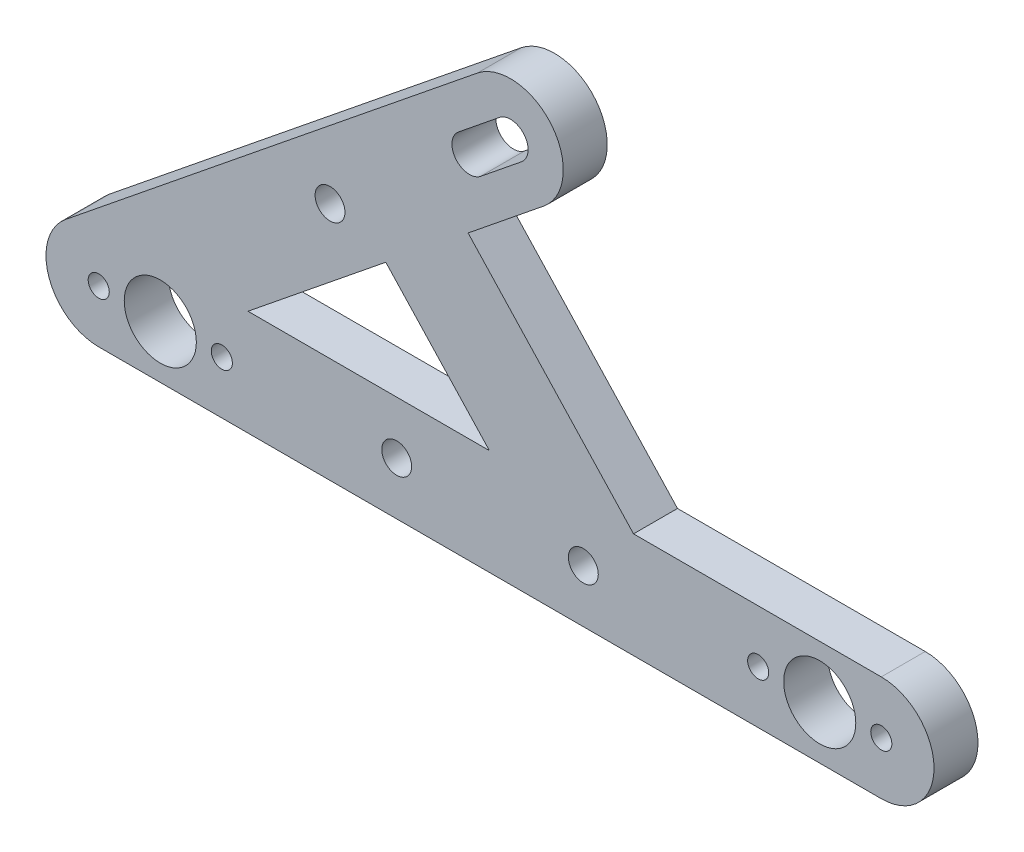
ISO-10303-21;
HEADER;
FILE_DESCRIPTION(('STEP AP214'),'2;1');
FILE_NAME('part.step','',(''),(''),'','','');
FILE_SCHEMA(('AUTOMOTIVE_DESIGN { 1 0 10303 214 1 1 1 1 }'));
ENDSEC;
DATA;
#1=APPLICATION_CONTEXT('core data for automotive mechanical design processes');
#2=APPLICATION_PROTOCOL_DEFINITION('international standard','automotive_design',2000,#1);
#3=PRODUCT_CONTEXT('',#1,'mechanical');
#4=PRODUCT('Part','Part','',(#3));
#5=PRODUCT_RELATED_PRODUCT_CATEGORY('part','',(#4));
#6=PRODUCT_DEFINITION_FORMATION('','',#4);
#7=PRODUCT_DEFINITION_CONTEXT('part definition',#1,'design');
#8=PRODUCT_DEFINITION('design','',#6,#7);
#9=PRODUCT_DEFINITION_SHAPE('','',#8);
#10=(LENGTH_UNIT() NAMED_UNIT(*) SI_UNIT(.MILLI.,.METRE.));
#11=(NAMED_UNIT(*) PLANE_ANGLE_UNIT() SI_UNIT($,.RADIAN.));
#12=(NAMED_UNIT(*) SI_UNIT($,.STERADIAN.) SOLID_ANGLE_UNIT());
#13=UNCERTAINTY_MEASURE_WITH_UNIT(LENGTH_MEASURE(1.E-05),#10,'distance_accuracy_value','');
#14=(GEOMETRIC_REPRESENTATION_CONTEXT(3) GLOBAL_UNCERTAINTY_ASSIGNED_CONTEXT((#13)) GLOBAL_UNIT_ASSIGNED_CONTEXT((#10,
#11,#12)) REPRESENTATION_CONTEXT('',''));
#15=CARTESIAN_POINT('',(0.,0.,0.));
#16=DIRECTION('',(0.,0.,1.));
#17=DIRECTION('',(1.,0.,0.));
#18=AXIS2_PLACEMENT_3D('',#15,#16,#17);
#19=CARTESIAN_POINT('',(-4.90702682254123,-88.9413767681293,0.));
#20=DIRECTION('',(0.,0.,1.));
#21=DIRECTION('',(1.,0.,0.));
#22=AXIS2_PLACEMENT_3D('',#19,#20,#21);
#23=PLANE('',#22);
#24=CARTESIAN_POINT('',(-18.192282617443,21.2543218490518,0.));
#25=DIRECTION('',(0.,0.,1.));
#26=DIRECTION('',(1.,0.,0.));
#27=AXIS2_PLACEMENT_3D('',#24,#25,#26);
#28=CIRCLE('',#27,1.7);
#29=CARTESIAN_POINT('',(-16.492282617443,21.2543218490518,0.));
#30=VERTEX_POINT('',#29);
#31=EDGE_CURVE('E372',#30,#30,#28,.T.);
#32=ORIENTED_EDGE('',*,*,#31,.T.);
#33=EDGE_LOOP('',(#32));
#34=FACE_BOUND('',#33,.T.);
#35=CARTESIAN_POINT('',(10.6132486540519,5.77662917500277E-13,0.));
#36=DIRECTION('',(0.,0.,1.));
#37=DIRECTION('',(1.,0.,0.));
#38=AXIS2_PLACEMENT_3D('',#35,#36,#37);
#39=CIRCLE('',#38,1.7);
#40=CARTESIAN_POINT('',(12.3132486540519,5.77662917500277E-13,0.));
#41=VERTEX_POINT('',#40);
#42=EDGE_CURVE('E382',#41,#41,#39,.T.);
#43=ORIENTED_EDGE('',*,*,#42,.T.);
#44=EDGE_LOOP('',(#43));
#45=FACE_BOUND('',#44,.T.);
#46=CARTESIAN_POINT('',(-10.6132486540519,3.71230823859037E-13,0.));
#47=DIRECTION('',(0.,0.,1.));
#48=DIRECTION('',(1.,0.,0.));
#49=AXIS2_PLACEMENT_3D('',#46,#47,#48);
#50=CIRCLE('',#49,1.7);
#51=CARTESIAN_POINT('',(-8.91324865405189,3.71230823859037E-13,0.));
#52=VERTEX_POINT('',#51);
#53=EDGE_CURVE('E388',#52,#52,#50,.T.);
#54=ORIENTED_EDGE('',*,*,#53,.T.);
#55=EDGE_LOOP('',(#54));
#56=FACE_BOUND('',#55,.T.);
#57=CARTESIAN_POINT('',(37.5,0.,0.));
#58=DIRECTION('',(0.,0.,1.));
#59=DIRECTION('',(1.,0.,0.));
#60=AXIS2_PLACEMENT_3D('',#57,#58,#59);
#61=CIRCLE('',#60,4.1);
#62=CARTESIAN_POINT('',(41.6,0.,0.));
#63=VERTEX_POINT('',#62);
#64=EDGE_CURVE('E393',#63,#63,#61,.T.);
#65=ORIENTED_EDGE('',*,*,#64,.T.);
#66=EDGE_LOOP('',(#65));
#67=FACE_BOUND('',#66,.T.);
#68=CARTESIAN_POINT('',(44.5,0.,0.));
#69=DIRECTION('',(0.,0.,-1.));
#70=DIRECTION('',(-1.,0.,0.));
#71=AXIS2_PLACEMENT_3D('',#68,#69,#70);
#72=CIRCLE('',#71,1.19999999999999);
#73=CARTESIAN_POINT('',(43.3,0.,0.));
#74=VERTEX_POINT('',#73);
#75=EDGE_CURVE('E259',#74,#74,#72,.T.);
#76=ORIENTED_EDGE('',*,*,#75,.F.);
#77=EDGE_LOOP('',(#76));
#78=FACE_BOUND('',#77,.T.);
#79=CARTESIAN_POINT('',(30.5,0.,0.));
#80=DIRECTION('',(0.,0.,-1.));
#81=DIRECTION('',(-1.,0.,0.));
#82=AXIS2_PLACEMENT_3D('',#79,#80,#81);
#83=CIRCLE('',#82,1.19999999999999);
#84=CARTESIAN_POINT('',(29.3,0.,0.));
#85=VERTEX_POINT('',#84);
#86=EDGE_CURVE('E249',#85,#85,#83,.T.);
#87=ORIENTED_EDGE('',*,*,#86,.F.);
#88=EDGE_LOOP('',(#87));
#89=FACE_BOUND('',#88,.T.);
#90=CARTESIAN_POINT('',(-37.5,0.,0.));
#91=DIRECTION('',(0.,0.,-1.));
#92=DIRECTION('',(-1.,0.,0.));
#93=AXIS2_PLACEMENT_3D('',#90,#91,#92);
#94=CIRCLE('',#93,4.1);
#95=CARTESIAN_POINT('',(-41.6,0.,0.));
#96=VERTEX_POINT('',#95);
#97=EDGE_CURVE('E246',#96,#96,#94,.T.);
#98=ORIENTED_EDGE('',*,*,#97,.F.);
#99=EDGE_LOOP('',(#98));
#100=FACE_BOUND('',#99,.T.);
#101=DIRECTION('',(0.777857622483366,0.628440545433317,0.));
#102=VECTOR('',#101,1.);
#103=CARTESIAN_POINT('',(-60.2509938319808,-20.4389115634421,0.));
#104=LINE('',#103,#102);
#105=CARTESIAN_POINT('',(-2.49271432583646,26.2246983659027,0.));
#106=VERTEX_POINT('',#105);
#107=CARTESIAN_POINT('',(6.10421614004999,33.1702620717459,0.));
#108=VERTEX_POINT('',#107);
#109=EDGE_CURVE('E202',#106,#108,#104,.T.);
#110=ORIENTED_EDGE('',*,*,#109,.F.);
#111=DIRECTION('',(0.681170300669379,-0.732125004002724,0.));
#112=VECTOR('',#111,1.);
#113=CARTESIAN_POINT('',(53.820591644515,-34.301104533072,0.));
#114=LINE('',#113,#112);
#115=CARTESIAN_POINT('',(16.3243780989951,6.00000000000002,0.));
#116=VERTEX_POINT('',#115);
#117=EDGE_CURVE('E217',#106,#116,#114,.T.);
#118=ORIENTED_EDGE('',*,*,#117,.T.);
#119=DIRECTION('',(1.,0.,0.));
#120=VECTOR('',#119,1.);
#121=CARTESIAN_POINT('',(-4.90702682254415,5.99999999999937,0.));
#122=LINE('',#121,#120);
#123=CARTESIAN_POINT('',(44.5,6.00000000000089,0.));
#124=VERTEX_POINT('',#123);
#125=EDGE_CURVE('E215',#116,#124,#122,.T.);
#126=ORIENTED_EDGE('',*,*,#125,.T.);
#127=CARTESIAN_POINT('',(44.5,0.,0.));
#128=DIRECTION('',(0.,0.,1.));
#129=DIRECTION('',(1.,0.,0.));
#130=AXIS2_PLACEMENT_3D('',#127,#128,#129);
#131=CIRCLE('',#130,5.99999999999999);
#132=CARTESIAN_POINT('',(44.5,-5.99999999999909,0.));
#133=VERTEX_POINT('',#132);
#134=EDGE_CURVE('E169',#133,#124,#131,.T.);
#135=ORIENTED_EDGE('',*,*,#134,.F.);
#136=DIRECTION('',(1.,0.,0.));
#137=VECTOR('',#136,1.);
#138=CARTESIAN_POINT('',(-4.90702682254203,-5.99999999999958,0.));
#139=LINE('',#138,#137);
#140=CARTESIAN_POINT('',(-44.5,-5.99999999999996,0.));
#141=VERTEX_POINT('',#140);
#142=EDGE_CURVE('E212',#141,#133,#139,.T.);
#143=ORIENTED_EDGE('',*,*,#142,.F.);
#144=CARTESIAN_POINT('',(-44.5,0.,0.));
#145=DIRECTION('',(0.,0.,1.));
#146=DIRECTION('',(1.,0.,0.));
#147=AXIS2_PLACEMENT_3D('',#144,#145,#146);
#148=CIRCLE('',#147,5.99999999999997);
#149=CARTESIAN_POINT('',(-48.2706432725998,4.6671457349002,0.));
#150=VERTEX_POINT('',#149);
#151=EDGE_CURVE('E210',#150,#141,#148,.T.);
#152=ORIENTED_EDGE('',*,*,#151,.F.);
#153=DIRECTION('',(0.777857622483366,0.628440545433318,0.));
#154=VECTOR('',#153,1.);
#155=CARTESIAN_POINT('',(-67.7922803771806,-11.1046200936417,0.));
#156=LINE('',#155,#154);
#157=CARTESIAN_POINT('',(-1.43707040514988,42.5045535415463,0.));
#158=VERTEX_POINT('',#157);
#159=EDGE_CURVE('E207',#150,#158,#156,.T.);
#160=ORIENTED_EDGE('',*,*,#159,.T.);
#161=CARTESIAN_POINT('',(2.3335728674501,37.8374078066462,0.));
#162=DIRECTION('',(0.,0.,1.));
#163=DIRECTION('',(1.,0.,0.));
#164=AXIS2_PLACEMENT_3D('',#161,#162,#163);
#165=CIRCLE('',#164,6.00000000000001);
#166=EDGE_CURVE('E204',#108,#158,#165,.T.);
#167=ORIENTED_EDGE('',*,*,#166,.F.);
#168=EDGE_LOOP('',(#110,#118,#126,#135,#143,#152,#160,#167));
#169=FACE_BOUND('',#168,.T.);
#170=CARTESIAN_POINT('',(-2.3335728674501,34.0667645340463,0.));
#171=DIRECTION('',(0.,0.,1.));
#172=DIRECTION('',(1.,0.,0.));
#173=AXIS2_PLACEMENT_3D('',#170,#171,#172);
#174=CIRCLE('',#173,1.99999999999999);
#175=CARTESIAN_POINT('',(-3.59045395831675,35.622479779013,0.));
#176=VERTEX_POINT('',#175);
#177=CARTESIAN_POINT('',(-1.0766917765835,32.5110492890795,0.));
#178=VERTEX_POINT('',#177);
#179=EDGE_CURVE('E190',#176,#178,#174,.T.);
#180=ORIENTED_EDGE('',*,*,#179,.T.);
#181=DIRECTION('',(-0.777857622483366,-0.628440545433317,0.));
#182=VECTOR('',#181,1.);
#183=CARTESIAN_POINT('',(-62.764756013714,-17.3274810735086,0.));
#184=LINE('',#183,#182);
#185=CARTESIAN_POINT('',(3.5904539583167,36.2816925616794,0.));
#186=VERTEX_POINT('',#185);
#187=EDGE_CURVE('E199',#186,#178,#184,.T.);
#188=ORIENTED_EDGE('',*,*,#187,.F.);
#189=CARTESIAN_POINT('',(2.33357286745011,37.8374078066461,0.));
#190=DIRECTION('',(0.,0.,1.));
#191=DIRECTION('',(1.,0.,0.));
#192=AXIS2_PLACEMENT_3D('',#189,#190,#191);
#193=CIRCLE('',#192,1.99999999999999);
#194=CARTESIAN_POINT('',(1.07669177658343,39.3931230516128,0.));
#195=VERTEX_POINT('',#194);
#196=EDGE_CURVE('E196',#186,#195,#193,.T.);
#197=ORIENTED_EDGE('',*,*,#196,.T.);
#198=DIRECTION('',(-0.777857622483366,-0.628440545433318,0.));
#199=VECTOR('',#198,1.);
#200=CARTESIAN_POINT('',(-65.2785181954473,-14.2160505835752,0.));
#201=LINE('',#200,#199);
#202=EDGE_CURVE('E193',#195,#176,#201,.T.);
#203=ORIENTED_EDGE('',*,*,#202,.T.);
#204=EDGE_LOOP('',(#180,#188,#197,#203));
#205=FACE_BOUND('',#204,.T.);
#206=DIRECTION('',(1.,0.,0.));
#207=VECTOR('',#206,1.);
#208=CARTESIAN_POINT('',(-4.90702682254122,6.00000000000002,0.));
#209=LINE('',#208,#207);
#210=CARTESIAN_POINT('',(-27.5260064974879,6.,0.));
#211=VERTEX_POINT('',#210);
#212=CARTESIAN_POINT('',(-0.0662654856284986,6.00000000000002,0.));
#213=VERTEX_POINT('',#212);
#214=EDGE_CURVE('E181',#211,#213,#209,.T.);
#215=ORIENTED_EDGE('',*,*,#214,.T.);
#216=DIRECTION('',(0.681170300669378,-0.732125004002724,0.));
#217=VECTOR('',#216,1.);
#218=CARTESIAN_POINT('',(45.0350915964825,-42.4751481411044,0.));
#219=LINE('',#218,#217);
#220=CARTESIAN_POINT('',(-11.8497991840658,18.6649967675587,0.));
#221=VERTEX_POINT('',#220);
#222=EDGE_CURVE('E187',#221,#213,#219,.T.);
#223=ORIENTED_EDGE('',*,*,#222,.F.);
#224=DIRECTION('',(0.777857622483366,0.628440545433317,0.));
#225=VECTOR('',#224,1.);
#226=CARTESIAN_POINT('',(-60.2509938319807,-20.4389115634421,0.));
#227=LINE('',#226,#225);
#228=EDGE_CURVE('E184',#211,#221,#227,.T.);
#229=ORIENTED_EDGE('',*,*,#228,.F.);
#230=EDGE_LOOP('',(#215,#223,#229));
#231=FACE_BOUND('',#230,.T.);
#232=CARTESIAN_POINT('',(-30.5,0.,0.));
#233=DIRECTION('',(0.,0.,-1.));
#234=DIRECTION('',(-1.,0.,0.));
#235=AXIS2_PLACEMENT_3D('',#232,#233,#234);
#236=CIRCLE('',#235,1.2);
#237=CARTESIAN_POINT('',(-31.7,0.,0.));
#238=VERTEX_POINT('',#237);
#239=EDGE_CURVE('E268',#238,#238,#236,.T.);
#240=ORIENTED_EDGE('',*,*,#239,.F.);
#241=EDGE_LOOP('',(#240));
#242=FACE_BOUND('',#241,.T.);
#243=CARTESIAN_POINT('',(-44.5,0.,0.));
#244=DIRECTION('',(0.,0.,-1.));
#245=DIRECTION('',(-1.,0.,0.));
#246=AXIS2_PLACEMENT_3D('',#243,#244,#245);
#247=CIRCLE('',#246,1.2);
#248=CARTESIAN_POINT('',(-45.7,0.,0.));
#249=VERTEX_POINT('',#248);
#250=EDGE_CURVE('E245',#249,#249,#247,.T.);
#251=ORIENTED_EDGE('',*,*,#250,.F.);
#252=EDGE_LOOP('',(#251));
#253=FACE_BOUND('',#252,.T.);
#254=ADVANCED_FACE('F36',(#34,#45,#56,#67,#78,#89,#100,#169,#205,#231,#242,#253),#23,.F.);
#255=CARTESIAN_POINT('',(-60.2509938319808,-20.4389115634421,5.));
#256=DIRECTION('',(-0.628440545433317,0.777857622483366,0.));
#257=DIRECTION('',(-0.777857622483366,-0.628440545433317,0.));
#258=AXIS2_PLACEMENT_3D('',#255,#256,#257);
#259=PLANE('',#258);
#260=ORIENTED_EDGE('',*,*,#109,.T.);
#261=DIRECTION('',(0.,0.,-1.));
#262=VECTOR('',#261,1.);
#263=CARTESIAN_POINT('',(6.10421614004999,33.1702620717459,5.));
#264=LINE('',#263,#262);
#265=CARTESIAN_POINT('',(6.10421614004999,33.1702620717459,5.));
#266=VERTEX_POINT('',#265);
#267=EDGE_CURVE('E11',#266,#108,#264,.T.);
#268=ORIENTED_EDGE('',*,*,#267,.F.);
#269=DIRECTION('',(0.777857622483366,0.628440545433317,0.));
#270=VECTOR('',#269,1.);
#271=CARTESIAN_POINT('',(-60.2509938319808,-20.4389115634421,5.));
#272=LINE('',#271,#270);
#273=CARTESIAN_POINT('',(-2.49271432583646,26.2246983659027,5.));
#274=VERTEX_POINT('',#273);
#275=EDGE_CURVE('E289',#274,#266,#272,.T.);
#276=ORIENTED_EDGE('',*,*,#275,.F.);
#277=DIRECTION('',(0.,0.,-1.));
#278=VECTOR('',#277,1.);
#279=CARTESIAN_POINT('',(-2.49271432583646,26.2246983659027,5.));
#280=LINE('',#279,#278);
#281=EDGE_CURVE('E55',#274,#106,#280,.T.);
#282=ORIENTED_EDGE('',*,*,#281,.T.);
#283=EDGE_LOOP('',(#260,#268,#276,#282));
#284=FACE_BOUND('',#283,.T.);
#285=ADVANCED_FACE('F325',(#284),#259,.F.);
#286=CARTESIAN_POINT('',(2.3335728674501,37.8374078066462,5.));
#287=DIRECTION('',(0.,0.,-1.));
#288=DIRECTION('',(-1.,0.,0.));
#289=AXIS2_PLACEMENT_3D('',#286,#287,#288);
#290=CYLINDRICAL_SURFACE('',#289,6.00000000000001);
#291=ORIENTED_EDGE('',*,*,#166,.T.);
#292=DIRECTION('',(0.,0.,-1.));
#293=VECTOR('',#292,1.);
#294=CARTESIAN_POINT('',(-1.43707040514988,42.5045535415463,5.));
#295=LINE('',#294,#293);
#296=CARTESIAN_POINT('',(-1.43707040514988,42.5045535415463,5.));
#297=VERTEX_POINT('',#296);
#298=EDGE_CURVE('E46',#297,#158,#295,.T.);
#299=ORIENTED_EDGE('',*,*,#298,.F.);
#300=CARTESIAN_POINT('',(2.3335728674501,37.8374078066462,5.));
#301=DIRECTION('',(0.,0.,1.));
#302=DIRECTION('',(1.,0.,0.));
#303=AXIS2_PLACEMENT_3D('',#300,#301,#302);
#304=CIRCLE('',#303,6.00000000000001);
#305=EDGE_CURVE('E291',#266,#297,#304,.T.);
#306=ORIENTED_EDGE('',*,*,#305,.F.);
#307=ORIENTED_EDGE('',*,*,#267,.T.);
#308=EDGE_LOOP('',(#291,#299,#306,#307));
#309=FACE_BOUND('',#308,.T.);
#310=ADVANCED_FACE('F330',(#309),#290,.T.);
#311=CARTESIAN_POINT('',(-67.7922803771806,-11.1046200936417,5.));
#312=DIRECTION('',(-0.628440545433318,0.777857622483366,0.));
#313=DIRECTION('',(-0.777857622483366,-0.628440545433318,0.));
#314=AXIS2_PLACEMENT_3D('',#311,#312,#313);
#315=PLANE('',#314);
#316=ORIENTED_EDGE('',*,*,#159,.F.);
#317=DIRECTION('',(0.,0.,-1.));
#318=VECTOR('',#317,1.);
#319=CARTESIAN_POINT('',(-48.2706432725998,4.6671457349002,5.));
#320=LINE('',#319,#318);
#321=CARTESIAN_POINT('',(-48.2706432725998,4.6671457349002,5.));
#322=VERTEX_POINT('',#321);
#323=EDGE_CURVE('E228',#322,#150,#320,.T.);
#324=ORIENTED_EDGE('',*,*,#323,.F.);
#325=DIRECTION('',(0.777857622483366,0.628440545433318,0.));
#326=VECTOR('',#325,1.);
#327=CARTESIAN_POINT('',(-67.7922803771806,-11.1046200936417,5.));
#328=LINE('',#327,#326);
#329=EDGE_CURVE('E293',#322,#297,#328,.T.);
#330=ORIENTED_EDGE('',*,*,#329,.T.);
#331=ORIENTED_EDGE('',*,*,#298,.T.);
#332=EDGE_LOOP('',(#316,#324,#330,#331));
#333=FACE_BOUND('',#332,.T.);
#334=ADVANCED_FACE('F465',(#333),#315,.T.);
#335=CARTESIAN_POINT('',(-44.5,0.,5.));
#336=DIRECTION('',(0.,0.,-1.));
#337=DIRECTION('',(-1.,0.,0.));
#338=AXIS2_PLACEMENT_3D('',#335,#336,#337);
#339=CYLINDRICAL_SURFACE('',#338,5.99999999999997);
#340=ORIENTED_EDGE('',*,*,#151,.T.);
#341=DIRECTION('',(0.,0.,-1.));
#342=VECTOR('',#341,1.);
#343=CARTESIAN_POINT('',(-44.5,-5.99999999999996,5.));
#344=LINE('',#343,#342);
#345=CARTESIAN_POINT('',(-44.5,-5.99999999999996,5.));
#346=VERTEX_POINT('',#345);
#347=EDGE_CURVE('E225',#346,#141,#344,.T.);
#348=ORIENTED_EDGE('',*,*,#347,.F.);
#349=CARTESIAN_POINT('',(-44.5,0.,5.));
#350=DIRECTION('',(0.,0.,1.));
#351=DIRECTION('',(1.,0.,0.));
#352=AXIS2_PLACEMENT_3D('',#349,#350,#351);
#353=CIRCLE('',#352,5.99999999999997);
#354=EDGE_CURVE('E296',#322,#346,#353,.T.);
#355=ORIENTED_EDGE('',*,*,#354,.F.);
#356=ORIENTED_EDGE('',*,*,#323,.T.);
#357=EDGE_LOOP('',(#340,#348,#355,#356));
#358=FACE_BOUND('',#357,.T.);
#359=ADVANCED_FACE('F301',(#358),#339,.T.);
#360=CARTESIAN_POINT('',(-4.90702682254203,-5.99999999999958,5.));
#361=DIRECTION('',(0.,1.,0.));
#362=DIRECTION('',(-1.,0.,0.));
#363=AXIS2_PLACEMENT_3D('',#360,#361,#362);
#364=PLANE('',#363);
#365=ORIENTED_EDGE('',*,*,#142,.T.);
#366=DIRECTION('',(0.,0.,-1.));
#367=VECTOR('',#366,1.);
#368=CARTESIAN_POINT('',(44.5,-5.99999999999909,5.));
#369=LINE('',#368,#367);
#370=CARTESIAN_POINT('',(44.5,-5.99999999999909,5.));
#371=VERTEX_POINT('',#370);
#372=EDGE_CURVE('E172',#371,#133,#369,.T.);
#373=ORIENTED_EDGE('',*,*,#372,.F.);
#374=DIRECTION('',(1.,0.,0.));
#375=VECTOR('',#374,1.);
#376=CARTESIAN_POINT('',(-4.90702682254203,-5.99999999999958,5.));
#377=LINE('',#376,#375);
#378=EDGE_CURVE('E160',#346,#371,#377,.T.);
#379=ORIENTED_EDGE('',*,*,#378,.F.);
#380=ORIENTED_EDGE('',*,*,#347,.T.);
#381=EDGE_LOOP('',(#365,#373,#379,#380));
#382=FACE_BOUND('',#381,.T.);
#383=ADVANCED_FACE('F305',(#382),#364,.F.);
#384=CARTESIAN_POINT('',(44.5,0.,5.));
#385=DIRECTION('',(0.,0.,-1.));
#386=DIRECTION('',(-1.,0.,0.));
#387=AXIS2_PLACEMENT_3D('',#384,#385,#386);
#388=CYLINDRICAL_SURFACE('',#387,5.99999999999999);
#389=ORIENTED_EDGE('',*,*,#134,.T.);
#390=DIRECTION('',(0.,0.,-1.));
#391=VECTOR('',#390,1.);
#392=CARTESIAN_POINT('',(44.5,6.00000000000089,5.));
#393=LINE('',#392,#391);
#394=CARTESIAN_POINT('',(44.5,6.00000000000089,5.));
#395=VERTEX_POINT('',#394);
#396=EDGE_CURVE('E166',#395,#124,#393,.T.);
#397=ORIENTED_EDGE('',*,*,#396,.F.);
#398=CARTESIAN_POINT('',(44.5,0.,5.));
#399=DIRECTION('',(0.,0.,1.));
#400=DIRECTION('',(1.,0.,0.));
#401=AXIS2_PLACEMENT_3D('',#398,#399,#400);
#402=CIRCLE('',#401,5.99999999999999);
#403=EDGE_CURVE('E152',#371,#395,#402,.T.);
#404=ORIENTED_EDGE('',*,*,#403,.F.);
#405=ORIENTED_EDGE('',*,*,#372,.T.);
#406=EDGE_LOOP('',(#389,#397,#404,#405));
#407=FACE_BOUND('',#406,.T.);
#408=ADVANCED_FACE('F167',(#407),#388,.T.);
#409=CARTESIAN_POINT('',(-4.90702682254415,5.99999999999937,5.));
#410=DIRECTION('',(0.,1.,0.));
#411=DIRECTION('',(-1.,0.,0.));
#412=AXIS2_PLACEMENT_3D('',#409,#410,#411);
#413=PLANE('',#412);
#414=ORIENTED_EDGE('',*,*,#125,.F.);
#415=DIRECTION('',(0.,0.,-1.));
#416=VECTOR('',#415,1.);
#417=CARTESIAN_POINT('',(16.3243780989951,6.00000000000002,5.));
#418=LINE('',#417,#416);
#419=CARTESIAN_POINT('',(16.3243780989951,6.00000000000002,5.));
#420=VERTEX_POINT('',#419);
#421=EDGE_CURVE('E102',#420,#116,#418,.T.);
#422=ORIENTED_EDGE('',*,*,#421,.F.);
#423=DIRECTION('',(1.,0.,0.));
#424=VECTOR('',#423,1.);
#425=CARTESIAN_POINT('',(-4.90702682254415,5.99999999999937,5.));
#426=LINE('',#425,#424);
#427=EDGE_CURVE('E158',#420,#395,#426,.T.);
#428=ORIENTED_EDGE('',*,*,#427,.T.);
#429=ORIENTED_EDGE('',*,*,#396,.T.);
#430=EDGE_LOOP('',(#414,#422,#428,#429));
#431=FACE_BOUND('',#430,.T.);
#432=ADVANCED_FACE('F174',(#431),#413,.T.);
#433=CARTESIAN_POINT('',(-2.3335728674501,34.0667645340463,5.));
#434=DIRECTION('',(0.,0.,-1.));
#435=DIRECTION('',(-1.,0.,0.));
#436=AXIS2_PLACEMENT_3D('',#433,#434,#435);
#437=CYLINDRICAL_SURFACE('',#436,1.99999999999999);
#438=ORIENTED_EDGE('',*,*,#179,.F.);
#439=DIRECTION('',(0.,0.,-1.));
#440=VECTOR('',#439,1.);
#441=CARTESIAN_POINT('',(-3.59045395831675,35.622479779013,5.));
#442=LINE('',#441,#440);
#443=CARTESIAN_POINT('',(-3.59045395831675,35.622479779013,5.));
#444=VERTEX_POINT('',#443);
#445=EDGE_CURVE('E222',#444,#176,#442,.T.);
#446=ORIENTED_EDGE('',*,*,#445,.F.);
#447=CARTESIAN_POINT('',(-2.3335728674501,34.0667645340463,5.));
#448=DIRECTION('',(0.,0.,1.));
#449=DIRECTION('',(1.,0.,0.));
#450=AXIS2_PLACEMENT_3D('',#447,#448,#449);
#451=CIRCLE('',#450,1.99999999999999);
#452=CARTESIAN_POINT('',(-1.0766917765835,32.5110492890795,5.));
#453=VERTEX_POINT('',#452);
#454=EDGE_CURVE('E278',#444,#453,#451,.T.);
#455=ORIENTED_EDGE('',*,*,#454,.T.);
#456=DIRECTION('',(0.,0.,-1.));
#457=VECTOR('',#456,1.);
#458=CARTESIAN_POINT('',(-1.0766917765835,32.5110492890795,5.));
#459=LINE('',#458,#457);
#460=EDGE_CURVE('E231',#453,#178,#459,.T.);
#461=ORIENTED_EDGE('',*,*,#460,.T.);
#462=EDGE_LOOP('',(#438,#446,#455,#461));
#463=FACE_BOUND('',#462,.T.);
#464=ADVANCED_FACE('F435',(#463),#437,.F.);
#465=CARTESIAN_POINT('',(-65.2785181954473,-14.2160505835752,5.));
#466=DIRECTION('',(0.628440545433318,-0.777857622483366,0.));
#467=DIRECTION('',(0.777857622483366,0.628440545433318,0.));
#468=AXIS2_PLACEMENT_3D('',#465,#466,#467);
#469=PLANE('',#468);
#470=ORIENTED_EDGE('',*,*,#202,.F.);
#471=DIRECTION('',(0.,0.,-1.));
#472=VECTOR('',#471,1.);
#473=CARTESIAN_POINT('',(1.07669177658343,39.3931230516128,5.));
#474=LINE('',#473,#472);
#475=CARTESIAN_POINT('',(1.07669177658343,39.3931230516128,5.));
#476=VERTEX_POINT('',#475);
#477=EDGE_CURVE('E235',#476,#195,#474,.T.);
#478=ORIENTED_EDGE('',*,*,#477,.F.);
#479=DIRECTION('',(-0.777857622483366,-0.628440545433318,0.));
#480=VECTOR('',#479,1.);
#481=CARTESIAN_POINT('',(-65.2785181954473,-14.2160505835752,5.));
#482=LINE('',#481,#480);
#483=EDGE_CURVE('E281',#476,#444,#482,.T.);
#484=ORIENTED_EDGE('',*,*,#483,.T.);
#485=ORIENTED_EDGE('',*,*,#445,.T.);
#486=EDGE_LOOP('',(#470,#478,#484,#485));
#487=FACE_BOUND('',#486,.T.);
#488=ADVANCED_FACE('F428',(#487),#469,.T.);
#489=CARTESIAN_POINT('',(2.33357286745011,37.8374078066461,5.));
#490=DIRECTION('',(0.,0.,-1.));
#491=DIRECTION('',(-1.,0.,0.));
#492=AXIS2_PLACEMENT_3D('',#489,#490,#491);
#493=CYLINDRICAL_SURFACE('',#492,1.99999999999999);
#494=ORIENTED_EDGE('',*,*,#196,.F.);
#495=DIRECTION('',(0.,0.,-1.));
#496=VECTOR('',#495,1.);
#497=CARTESIAN_POINT('',(3.5904539583167,36.2816925616794,5.));
#498=LINE('',#497,#496);
#499=CARTESIAN_POINT('',(3.5904539583167,36.2816925616794,5.));
#500=VERTEX_POINT('',#499);
#501=EDGE_CURVE('E233',#500,#186,#498,.T.);
#502=ORIENTED_EDGE('',*,*,#501,.F.);
#503=CARTESIAN_POINT('',(2.33357286745011,37.8374078066461,5.));
#504=DIRECTION('',(0.,0.,1.));
#505=DIRECTION('',(1.,0.,0.));
#506=AXIS2_PLACEMENT_3D('',#503,#504,#505);
#507=CIRCLE('',#506,1.99999999999999);
#508=EDGE_CURVE('E284',#500,#476,#507,.T.);
#509=ORIENTED_EDGE('',*,*,#508,.T.);
#510=ORIENTED_EDGE('',*,*,#477,.T.);
#511=EDGE_LOOP('',(#494,#502,#509,#510));
#512=FACE_BOUND('',#511,.T.);
#513=ADVANCED_FACE('F432',(#512),#493,.F.);
#514=CARTESIAN_POINT('',(-4.90702682254122,6.00000000000002,5.));
#515=DIRECTION('',(0.,1.,0.));
#516=DIRECTION('',(-1.,0.,0.));
#517=AXIS2_PLACEMENT_3D('',#514,#515,#516);
#518=PLANE('',#517);
#519=ORIENTED_EDGE('',*,*,#214,.F.);
#520=DIRECTION('',(0.,0.,-1.));
#521=VECTOR('',#520,1.);
#522=CARTESIAN_POINT('',(-27.5260064974879,6.,5.));
#523=LINE('',#522,#521);
#524=CARTESIAN_POINT('',(-27.5260064974879,6.,5.));
#525=VERTEX_POINT('',#524);
#526=EDGE_CURVE('E114',#525,#211,#523,.T.);
#527=ORIENTED_EDGE('',*,*,#526,.F.);
#528=DIRECTION('',(1.,0.,0.));
#529=VECTOR('',#528,1.);
#530=CARTESIAN_POINT('',(-4.90702682254122,6.00000000000002,5.));
#531=LINE('',#530,#529);
#532=CARTESIAN_POINT('',(-0.0662654856284986,6.00000000000002,5.));
#533=VERTEX_POINT('',#532);
#534=EDGE_CURVE('E220',#525,#533,#531,.T.);
#535=ORIENTED_EDGE('',*,*,#534,.T.);
#536=DIRECTION('',(0.,0.,-1.));
#537=VECTOR('',#536,1.);
#538=CARTESIAN_POINT('',(-0.0662654856284986,6.00000000000002,5.));
#539=LINE('',#538,#537);
#540=EDGE_CURVE('E177',#533,#213,#539,.T.);
#541=ORIENTED_EDGE('',*,*,#540,.T.);
#542=EDGE_LOOP('',(#519,#527,#535,#541));
#543=FACE_BOUND('',#542,.T.);
#544=ADVANCED_FACE('F38',(#543),#518,.T.);
#545=CARTESIAN_POINT('',(-60.2509938319807,-20.4389115634421,5.));
#546=DIRECTION('',(-0.628440545433317,0.777857622483366,0.));
#547=DIRECTION('',(-0.777857622483366,-0.628440545433317,0.));
#548=AXIS2_PLACEMENT_3D('',#545,#546,#547);
#549=PLANE('',#548);
#550=ORIENTED_EDGE('',*,*,#228,.T.);
#551=DIRECTION('',(0.,0.,-1.));
#552=VECTOR('',#551,1.);
#553=CARTESIAN_POINT('',(-11.8497991840658,18.6649967675587,5.));
#554=LINE('',#553,#552);
#555=CARTESIAN_POINT('',(-11.8497991840658,18.6649967675587,5.));
#556=VERTEX_POINT('',#555);
#557=EDGE_CURVE('E239',#556,#221,#554,.T.);
#558=ORIENTED_EDGE('',*,*,#557,.F.);
#559=DIRECTION('',(0.777857622483366,0.628440545433317,0.));
#560=VECTOR('',#559,1.);
#561=CARTESIAN_POINT('',(-60.2509938319807,-20.4389115634421,5.));
#562=LINE('',#561,#560);
#563=EDGE_CURVE('E274',#525,#556,#562,.T.);
#564=ORIENTED_EDGE('',*,*,#563,.F.);
#565=ORIENTED_EDGE('',*,*,#526,.T.);
#566=EDGE_LOOP('',(#550,#558,#564,#565));
#567=FACE_BOUND('',#566,.T.);
#568=ADVANCED_FACE('F449',(#567),#549,.F.);
#569=CARTESIAN_POINT('',(-62.764756013714,-17.3274810735086,5.));
#570=DIRECTION('',(0.628440545433317,-0.777857622483366,0.));
#571=DIRECTION('',(0.777857622483366,0.628440545433317,0.));
#572=AXIS2_PLACEMENT_3D('',#569,#570,#571);
#573=PLANE('',#572);
#574=ORIENTED_EDGE('',*,*,#187,.T.);
#575=ORIENTED_EDGE('',*,*,#460,.F.);
#576=DIRECTION('',(-0.777857622483366,-0.628440545433317,0.));
#577=VECTOR('',#576,1.);
#578=CARTESIAN_POINT('',(-62.764756013714,-17.3274810735086,5.));
#579=LINE('',#578,#577);
#580=EDGE_CURVE('E287',#500,#453,#579,.T.);
#581=ORIENTED_EDGE('',*,*,#580,.F.);
#582=ORIENTED_EDGE('',*,*,#501,.T.);
#583=EDGE_LOOP('',(#574,#575,#581,#582));
#584=FACE_BOUND('',#583,.T.);
#585=ADVANCED_FACE('F319',(#584),#573,.F.);
#586=CARTESIAN_POINT('',(45.0350915964825,-42.4751481411044,5.));
#587=DIRECTION('',(0.732125004002724,0.681170300669378,0.));
#588=DIRECTION('',(-0.681170300669378,0.732125004002724,0.));
#589=AXIS2_PLACEMENT_3D('',#586,#587,#588);
#590=PLANE('',#589);
#591=ORIENTED_EDGE('',*,*,#222,.T.);
#592=ORIENTED_EDGE('',*,*,#540,.F.);
#593=DIRECTION('',(0.681170300669378,-0.732125004002724,0.));
#594=VECTOR('',#593,1.);
#595=CARTESIAN_POINT('',(45.0350915964825,-42.4751481411044,5.));
#596=LINE('',#595,#594);
#597=EDGE_CURVE('E276',#556,#533,#596,.T.);
#598=ORIENTED_EDGE('',*,*,#597,.F.);
#599=ORIENTED_EDGE('',*,*,#557,.T.);
#600=EDGE_LOOP('',(#591,#592,#598,#599));
#601=FACE_BOUND('',#600,.T.);
#602=ADVANCED_FACE('F310',(#601),#590,.F.);
#603=CARTESIAN_POINT('',(53.820591644515,-34.301104533072,5.));
#604=DIRECTION('',(0.732125004002724,0.681170300669379,0.));
#605=DIRECTION('',(-0.681170300669379,0.732125004002724,0.));
#606=AXIS2_PLACEMENT_3D('',#603,#604,#605);
#607=PLANE('',#606);
#608=ORIENTED_EDGE('',*,*,#117,.F.);
#609=ORIENTED_EDGE('',*,*,#281,.F.);
#610=DIRECTION('',(0.681170300669379,-0.732125004002724,0.));
#611=VECTOR('',#610,1.);
#612=CARTESIAN_POINT('',(53.820591644515,-34.301104533072,5.));
#613=LINE('',#612,#611);
#614=EDGE_CURVE('E175',#274,#420,#613,.T.);
#615=ORIENTED_EDGE('',*,*,#614,.T.);
#616=ORIENTED_EDGE('',*,*,#421,.T.);
#617=EDGE_LOOP('',(#608,#609,#615,#616));
#618=FACE_BOUND('',#617,.T.);
#619=ADVANCED_FACE('F308',(#618),#607,.T.);
#620=CARTESIAN_POINT('',(-4.90702682254123,-88.9413767681293,5.));
#621=DIRECTION('',(0.,0.,1.));
#622=DIRECTION('',(1.,0.,0.));
#623=AXIS2_PLACEMENT_3D('',#620,#621,#622);
#624=PLANE('',#623);
#625=CARTESIAN_POINT('',(-18.192282617443,21.2543218490518,5.));
#626=DIRECTION('',(0.,0.,1.));
#627=DIRECTION('',(1.,0.,0.));
#628=AXIS2_PLACEMENT_3D('',#625,#626,#627);
#629=CIRCLE('',#628,1.69999999999999);
#630=CARTESIAN_POINT('',(-16.492282617443,21.2543218490518,5.));
#631=VERTEX_POINT('',#630);
#632=EDGE_CURVE('E375',#631,#631,#629,.T.);
#633=ORIENTED_EDGE('',*,*,#632,.F.);
#634=EDGE_LOOP('',(#633));
#635=FACE_BOUND('',#634,.T.);
#636=CARTESIAN_POINT('',(10.6132486540519,5.77662917500277E-13,5.));
#637=DIRECTION('',(0.,0.,1.));
#638=DIRECTION('',(1.,0.,0.));
#639=AXIS2_PLACEMENT_3D('',#636,#637,#638);
#640=CIRCLE('',#639,1.69999999999999);
#641=CARTESIAN_POINT('',(12.3132486540519,5.77662917500277E-13,5.));
#642=VERTEX_POINT('',#641);
#643=EDGE_CURVE('E377',#642,#642,#640,.T.);
#644=ORIENTED_EDGE('',*,*,#643,.F.);
#645=EDGE_LOOP('',(#644));
#646=FACE_BOUND('',#645,.T.);
#647=CARTESIAN_POINT('',(-10.6132486540519,3.71230823859037E-13,5.));
#648=DIRECTION('',(0.,0.,1.));
#649=DIRECTION('',(1.,0.,0.));
#650=AXIS2_PLACEMENT_3D('',#647,#648,#649);
#651=CIRCLE('',#650,1.69999999999999);
#652=CARTESIAN_POINT('',(-8.9132486540519,3.71230823859037E-13,5.));
#653=VERTEX_POINT('',#652);
#654=EDGE_CURVE('E385',#653,#653,#651,.T.);
#655=ORIENTED_EDGE('',*,*,#654,.F.);
#656=EDGE_LOOP('',(#655));
#657=FACE_BOUND('',#656,.T.);
#658=CARTESIAN_POINT('',(37.5,0.,5.));
#659=DIRECTION('',(0.,0.,1.));
#660=DIRECTION('',(1.,0.,0.));
#661=AXIS2_PLACEMENT_3D('',#658,#659,#660);
#662=CIRCLE('',#661,4.1);
#663=CARTESIAN_POINT('',(41.6,0.,5.));
#664=VERTEX_POINT('',#663);
#665=EDGE_CURVE('E391',#664,#664,#662,.T.);
#666=ORIENTED_EDGE('',*,*,#665,.F.);
#667=EDGE_LOOP('',(#666));
#668=FACE_BOUND('',#667,.T.);
#669=CARTESIAN_POINT('',(44.5,0.,5.));
#670=DIRECTION('',(0.,0.,1.));
#671=DIRECTION('',(1.,0.,0.));
#672=AXIS2_PLACEMENT_3D('',#669,#670,#671);
#673=CIRCLE('',#672,1.19999999999999);
#674=CARTESIAN_POINT('',(45.7,0.,5.));
#675=VERTEX_POINT('',#674);
#676=EDGE_CURVE('E40',#675,#675,#673,.T.);
#677=ORIENTED_EDGE('',*,*,#676,.F.);
#678=EDGE_LOOP('',(#677));
#679=FACE_BOUND('',#678,.T.);
#680=CARTESIAN_POINT('',(30.5,0.,5.));
#681=DIRECTION('',(0.,0.,1.));
#682=DIRECTION('',(1.,0.,0.));
#683=AXIS2_PLACEMENT_3D('',#680,#681,#682);
#684=CIRCLE('',#683,1.19999999999999);
#685=CARTESIAN_POINT('',(31.7,0.,5.));
#686=VERTEX_POINT('',#685);
#687=EDGE_CURVE('E247',#686,#686,#684,.T.);
#688=ORIENTED_EDGE('',*,*,#687,.F.);
#689=EDGE_LOOP('',(#688));
#690=FACE_BOUND('',#689,.T.);
#691=CARTESIAN_POINT('',(-37.5,0.,5.));
#692=DIRECTION('',(0.,0.,1.));
#693=DIRECTION('',(1.,0.,0.));
#694=AXIS2_PLACEMENT_3D('',#691,#692,#693);
#695=CIRCLE('',#694,4.1);
#696=CARTESIAN_POINT('',(-33.4,0.,5.));
#697=VERTEX_POINT('',#696);
#698=EDGE_CURVE('E243',#697,#697,#695,.T.);
#699=ORIENTED_EDGE('',*,*,#698,.F.);
#700=EDGE_LOOP('',(#699));
#701=FACE_BOUND('',#700,.T.);
#702=CARTESIAN_POINT('',(-44.5,0.,5.));
#703=DIRECTION('',(0.,0.,1.));
#704=DIRECTION('',(1.,0.,0.));
#705=AXIS2_PLACEMENT_3D('',#702,#703,#704);
#706=CIRCLE('',#705,1.2);
#707=CARTESIAN_POINT('',(-43.3,0.,5.));
#708=VERTEX_POINT('',#707);
#709=EDGE_CURVE('E265',#708,#708,#706,.T.);
#710=ORIENTED_EDGE('',*,*,#709,.F.);
#711=EDGE_LOOP('',(#710));
#712=FACE_BOUND('',#711,.T.);
#713=CARTESIAN_POINT('',(-30.5,0.,5.));
#714=DIRECTION('',(0.,0.,1.));
#715=DIRECTION('',(1.,0.,0.));
#716=AXIS2_PLACEMENT_3D('',#713,#714,#715);
#717=CIRCLE('',#716,1.2);
#718=CARTESIAN_POINT('',(-29.3,0.,5.));
#719=VERTEX_POINT('',#718);
#720=EDGE_CURVE('E185',#719,#719,#717,.T.);
#721=ORIENTED_EDGE('',*,*,#720,.F.);
#722=EDGE_LOOP('',(#721));
#723=FACE_BOUND('',#722,.T.);
#724=ORIENTED_EDGE('',*,*,#534,.F.);
#725=ORIENTED_EDGE('',*,*,#563,.T.);
#726=ORIENTED_EDGE('',*,*,#597,.T.);
#727=EDGE_LOOP('',(#724,#725,#726));
#728=FACE_BOUND('',#727,.T.);
#729=ORIENTED_EDGE('',*,*,#454,.F.);
#730=ORIENTED_EDGE('',*,*,#483,.F.);
#731=ORIENTED_EDGE('',*,*,#508,.F.);
#732=ORIENTED_EDGE('',*,*,#580,.T.);
#733=EDGE_LOOP('',(#729,#730,#731,#732));
#734=FACE_BOUND('',#733,.T.);
#735=ORIENTED_EDGE('',*,*,#275,.T.);
#736=ORIENTED_EDGE('',*,*,#305,.T.);
#737=ORIENTED_EDGE('',*,*,#329,.F.);
#738=ORIENTED_EDGE('',*,*,#354,.T.);
#739=ORIENTED_EDGE('',*,*,#378,.T.);
#740=ORIENTED_EDGE('',*,*,#403,.T.);
#741=ORIENTED_EDGE('',*,*,#427,.F.);
#742=ORIENTED_EDGE('',*,*,#614,.F.);
#743=EDGE_LOOP('',(#735,#736,#737,#738,#739,#740,#741,#742));
#744=FACE_BOUND('',#743,.T.);
#745=ADVANCED_FACE('F155',(#635,#646,#657,#668,#679,#690,#701,#712,#723,#728,#734,#744),#624,.T.);
#746=CARTESIAN_POINT('',(-30.5,0.,0.));
#747=DIRECTION('',(0.,0.,-1.));
#748=DIRECTION('',(-1.,0.,0.));
#749=AXIS2_PLACEMENT_3D('',#746,#747,#748);
#750=CYLINDRICAL_SURFACE('',#749,1.2);
#751=ORIENTED_EDGE('',*,*,#720,.T.);
#752=EDGE_LOOP('',(#751));
#753=FACE_BOUND('',#752,.T.);
#754=ORIENTED_EDGE('',*,*,#239,.T.);
#755=EDGE_LOOP('',(#754));
#756=FACE_BOUND('',#755,.T.);
#757=ADVANCED_FACE('F316',(#753,#756),#750,.F.);
#758=CARTESIAN_POINT('',(-44.5,0.,0.));
#759=DIRECTION('',(0.,0.,-1.));
#760=DIRECTION('',(-1.,0.,0.));
#761=AXIS2_PLACEMENT_3D('',#758,#759,#760);
#762=CYLINDRICAL_SURFACE('',#761,1.2);
#763=ORIENTED_EDGE('',*,*,#709,.T.);
#764=EDGE_LOOP('',(#763));
#765=FACE_BOUND('',#764,.T.);
#766=ORIENTED_EDGE('',*,*,#250,.T.);
#767=EDGE_LOOP('',(#766));
#768=FACE_BOUND('',#767,.T.);
#769=ADVANCED_FACE('F337',(#765,#768),#762,.F.);
#770=CARTESIAN_POINT('',(-37.5,0.,0.));
#771=DIRECTION('',(0.,0.,-1.));
#772=DIRECTION('',(-1.,0.,0.));
#773=AXIS2_PLACEMENT_3D('',#770,#771,#772);
#774=CYLINDRICAL_SURFACE('',#773,4.1);
#775=ORIENTED_EDGE('',*,*,#698,.T.);
#776=EDGE_LOOP('',(#775));
#777=FACE_BOUND('',#776,.T.);
#778=ORIENTED_EDGE('',*,*,#97,.T.);
#779=EDGE_LOOP('',(#778));
#780=FACE_BOUND('',#779,.T.);
#781=ADVANCED_FACE('F341',(#777,#780),#774,.F.);
#782=CARTESIAN_POINT('',(30.5,0.,0.));
#783=DIRECTION('',(0.,0.,-1.));
#784=DIRECTION('',(-1.,0.,0.));
#785=AXIS2_PLACEMENT_3D('',#782,#783,#784);
#786=CYLINDRICAL_SURFACE('',#785,1.19999999999999);
#787=ORIENTED_EDGE('',*,*,#687,.T.);
#788=EDGE_LOOP('',(#787));
#789=FACE_BOUND('',#788,.T.);
#790=ORIENTED_EDGE('',*,*,#86,.T.);
#791=EDGE_LOOP('',(#790));
#792=FACE_BOUND('',#791,.T.);
#793=ADVANCED_FACE('F345',(#789,#792),#786,.F.);
#794=CARTESIAN_POINT('',(44.5,0.,0.));
#795=DIRECTION('',(0.,0.,-1.));
#796=DIRECTION('',(-1.,0.,0.));
#797=AXIS2_PLACEMENT_3D('',#794,#795,#796);
#798=CYLINDRICAL_SURFACE('',#797,1.19999999999999);
#799=ORIENTED_EDGE('',*,*,#676,.T.);
#800=EDGE_LOOP('',(#799));
#801=FACE_BOUND('',#800,.T.);
#802=ORIENTED_EDGE('',*,*,#75,.T.);
#803=EDGE_LOOP('',(#802));
#804=FACE_BOUND('',#803,.T.);
#805=ADVANCED_FACE('F349',(#801,#804),#798,.F.);
#806=CARTESIAN_POINT('',(37.5,0.,5.));
#807=DIRECTION('',(0.,0.,1.));
#808=DIRECTION('',(1.,0.,0.));
#809=AXIS2_PLACEMENT_3D('',#806,#807,#808);
#810=CYLINDRICAL_SURFACE('',#809,4.1);
#811=ORIENTED_EDGE('',*,*,#665,.T.);
#812=EDGE_LOOP('',(#811));
#813=FACE_BOUND('',#812,.T.);
#814=ORIENTED_EDGE('',*,*,#64,.F.);
#815=EDGE_LOOP('',(#814));
#816=FACE_BOUND('',#815,.T.);
#817=ADVANCED_FACE('F352',(#813,#816),#810,.F.);
#818=CARTESIAN_POINT('',(-10.6132486540519,3.71230823859037E-13,5.));
#819=DIRECTION('',(0.,0.,1.));
#820=DIRECTION('',(1.,0.,0.));
#821=AXIS2_PLACEMENT_3D('',#818,#819,#820);
#822=CYLINDRICAL_SURFACE('',#821,1.69999999999999);
#823=ORIENTED_EDGE('',*,*,#53,.F.);
#824=EDGE_LOOP('',(#823));
#825=FACE_BOUND('',#824,.T.);
#826=ORIENTED_EDGE('',*,*,#654,.T.);
#827=EDGE_LOOP('',(#826));
#828=FACE_BOUND('',#827,.T.);
#829=ADVANCED_FACE('F356',(#825,#828),#822,.F.);
#830=CARTESIAN_POINT('',(10.6132486540519,5.77662917500277E-13,5.));
#831=DIRECTION('',(0.,0.,1.));
#832=DIRECTION('',(1.,0.,0.));
#833=AXIS2_PLACEMENT_3D('',#830,#831,#832);
#834=CYLINDRICAL_SURFACE('',#833,1.69999999999999);
#835=ORIENTED_EDGE('',*,*,#42,.F.);
#836=EDGE_LOOP('',(#835));
#837=FACE_BOUND('',#836,.T.);
#838=ORIENTED_EDGE('',*,*,#643,.T.);
#839=EDGE_LOOP('',(#838));
#840=FACE_BOUND('',#839,.T.);
#841=ADVANCED_FACE('F360',(#837,#840),#834,.F.);
#842=CARTESIAN_POINT('',(-18.192282617443,21.2543218490518,5.));
#843=DIRECTION('',(0.,0.,1.));
#844=DIRECTION('',(1.,0.,0.));
#845=AXIS2_PLACEMENT_3D('',#842,#843,#844);
#846=CYLINDRICAL_SURFACE('',#845,1.69999999999999);
#847=ORIENTED_EDGE('',*,*,#31,.F.);
#848=EDGE_LOOP('',(#847));
#849=FACE_BOUND('',#848,.T.);
#850=ORIENTED_EDGE('',*,*,#632,.T.);
#851=EDGE_LOOP('',(#850));
#852=FACE_BOUND('',#851,.T.);
#853=ADVANCED_FACE('F364',(#849,#852),#846,.F.);
#854=CLOSED_SHELL('',(#254,#285,#310,#334,#359,#383,#408,#432,#464,#488,#513,#544,#568,#585,
#602,#619,#745,#757,#769,#781,#793,#805,#817,#829,#841,#853));
#855=MANIFOLD_SOLID_BREP('B2',#854);
#856=ADVANCED_BREP_SHAPE_REPRESENTATION('',(#18,#855),#14);
#857=SHAPE_DEFINITION_REPRESENTATION(#9,#856);
ENDSEC;
END-ISO-10303-21;
